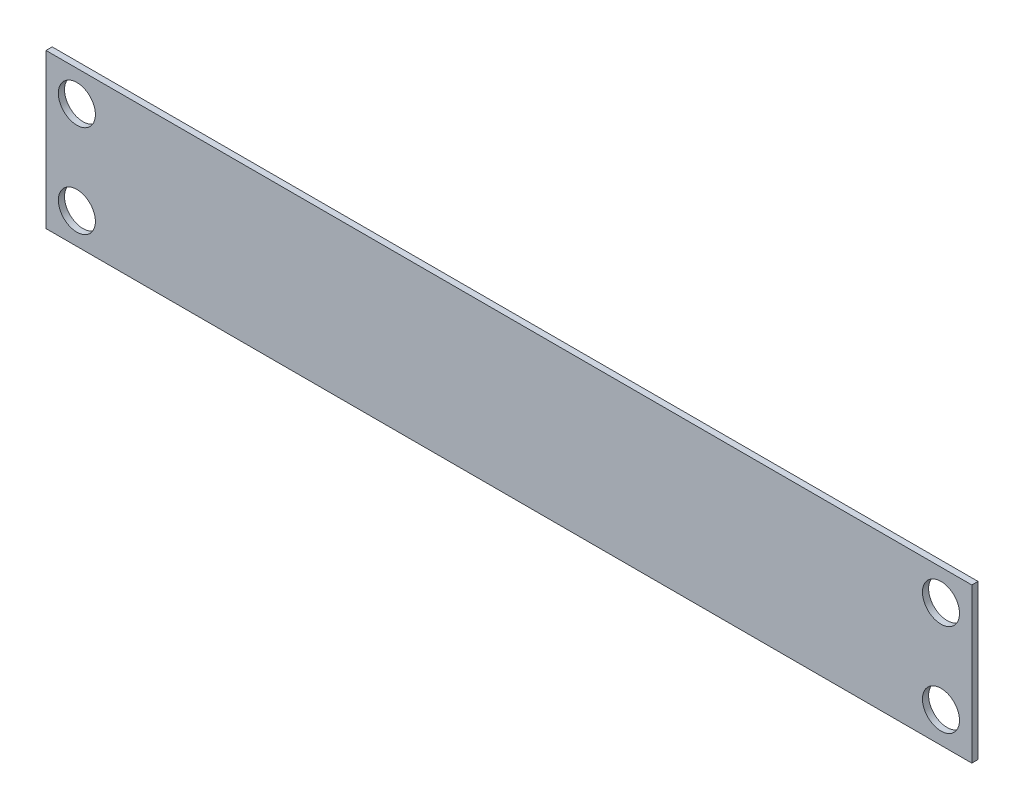
ISO-10303-21;
HEADER;
FILE_DESCRIPTION(('STEP AP214'),'2;1');
FILE_NAME('part.step','',(''),(''),'','','');
FILE_SCHEMA(('AUTOMOTIVE_DESIGN { 1 0 10303 214 1 1 1 1 }'));
ENDSEC;
DATA;
#1=APPLICATION_CONTEXT('core data for automotive mechanical design processes');
#2=APPLICATION_PROTOCOL_DEFINITION('international standard','automotive_design',2000,#1);
#3=PRODUCT_CONTEXT('',#1,'mechanical');
#4=PRODUCT('Part','Part','',(#3));
#5=PRODUCT_RELATED_PRODUCT_CATEGORY('part','',(#4));
#6=PRODUCT_DEFINITION_FORMATION('','',#4);
#7=PRODUCT_DEFINITION_CONTEXT('part definition',#1,'design');
#8=PRODUCT_DEFINITION('design','',#6,#7);
#9=PRODUCT_DEFINITION_SHAPE('','',#8);
#10=(LENGTH_UNIT() NAMED_UNIT(*) SI_UNIT(.MILLI.,.METRE.));
#11=(NAMED_UNIT(*) PLANE_ANGLE_UNIT() SI_UNIT($,.RADIAN.));
#12=(NAMED_UNIT(*) SI_UNIT($,.STERADIAN.) SOLID_ANGLE_UNIT());
#13=UNCERTAINTY_MEASURE_WITH_UNIT(LENGTH_MEASURE(1.E-05),#10,'distance_accuracy_value','');
#14=(GEOMETRIC_REPRESENTATION_CONTEXT(3) GLOBAL_UNCERTAINTY_ASSIGNED_CONTEXT((#13)) GLOBAL_UNIT_ASSIGNED_CONTEXT((#10,
#11,#12)) REPRESENTATION_CONTEXT('',''));
#15=CARTESIAN_POINT('',(0.,0.,0.));
#16=DIRECTION('',(0.,0.,1.));
#17=DIRECTION('',(1.,0.,0.));
#18=AXIS2_PLACEMENT_3D('',#15,#16,#17);
#19=CARTESIAN_POINT('',(150.,-25.,2.));
#20=DIRECTION('',(-1.,0.,0.));
#21=DIRECTION('',(0.,0.,1.));
#22=AXIS2_PLACEMENT_3D('',#19,#20,#21);
#23=PLANE('',#22);
#24=DIRECTION('',(0.,1.,0.));
#25=VECTOR('',#24,1.);
#26=CARTESIAN_POINT('',(150.,-25.,0.));
#27=LINE('',#26,#25);
#28=CARTESIAN_POINT('',(150.,-25.,0.));
#29=VERTEX_POINT('',#28);
#30=CARTESIAN_POINT('',(150.,25.,0.));
#31=VERTEX_POINT('',#30);
#32=EDGE_CURVE('E113',#29,#31,#27,.T.);
#33=ORIENTED_EDGE('',*,*,#32,.T.);
#34=DIRECTION('',(0.,0.,-1.));
#35=VECTOR('',#34,1.);
#36=CARTESIAN_POINT('',(150.,25.,2.));
#37=LINE('',#36,#35);
#38=CARTESIAN_POINT('',(150.,25.,2.));
#39=VERTEX_POINT('',#38);
#40=EDGE_CURVE('E11',#39,#31,#37,.T.);
#41=ORIENTED_EDGE('',*,*,#40,.F.);
#42=DIRECTION('',(0.,1.,0.));
#43=VECTOR('',#42,1.);
#44=CARTESIAN_POINT('',(150.,-25.,2.));
#45=LINE('',#44,#43);
#46=CARTESIAN_POINT('',(150.,-25.,2.));
#47=VERTEX_POINT('',#46);
#48=EDGE_CURVE('E97',#47,#39,#45,.T.);
#49=ORIENTED_EDGE('',*,*,#48,.F.);
#50=DIRECTION('',(0.,0.,-1.));
#51=VECTOR('',#50,1.);
#52=CARTESIAN_POINT('',(150.,-25.,2.));
#53=LINE('',#52,#51);
#54=EDGE_CURVE('E109',#47,#29,#53,.T.);
#55=ORIENTED_EDGE('',*,*,#54,.T.);
#56=EDGE_LOOP('',(#33,#41,#49,#55));
#57=FACE_BOUND('',#56,.T.);
#58=ADVANCED_FACE('F45',(#57),#23,.F.);
#59=CARTESIAN_POINT('',(-150.,25.,2.));
#60=DIRECTION('',(0.,-1.,0.));
#61=DIRECTION('',(0.,0.,-1.));
#62=AXIS2_PLACEMENT_3D('',#59,#60,#61);
#63=PLANE('',#62);
#64=DIRECTION('',(-1.,0.,0.));
#65=VECTOR('',#64,1.);
#66=CARTESIAN_POINT('',(-150.,25.,0.));
#67=LINE('',#66,#65);
#68=CARTESIAN_POINT('',(-150.,25.,0.));
#69=VERTEX_POINT('',#68);
#70=EDGE_CURVE('E102',#31,#69,#67,.T.);
#71=ORIENTED_EDGE('',*,*,#70,.T.);
#72=DIRECTION('',(0.,0.,-1.));
#73=VECTOR('',#72,1.);
#74=CARTESIAN_POINT('',(-150.,25.,2.));
#75=LINE('',#74,#73);
#76=CARTESIAN_POINT('',(-150.,25.,2.));
#77=VERTEX_POINT('',#76);
#78=EDGE_CURVE('E54',#77,#69,#75,.T.);
#79=ORIENTED_EDGE('',*,*,#78,.F.);
#80=DIRECTION('',(-1.,0.,0.));
#81=VECTOR('',#80,1.);
#82=CARTESIAN_POINT('',(-150.,25.,2.));
#83=LINE('',#82,#81);
#84=EDGE_CURVE('E92',#39,#77,#83,.T.);
#85=ORIENTED_EDGE('',*,*,#84,.F.);
#86=ORIENTED_EDGE('',*,*,#40,.T.);
#87=EDGE_LOOP('',(#71,#79,#85,#86));
#88=FACE_BOUND('',#87,.T.);
#89=ADVANCED_FACE('F101',(#88),#63,.F.);
#90=CARTESIAN_POINT('',(-150.,-25.,2.));
#91=DIRECTION('',(1.,0.,0.));
#92=DIRECTION('',(0.,0.,-1.));
#93=AXIS2_PLACEMENT_3D('',#90,#91,#92);
#94=PLANE('',#93);
#95=DIRECTION('',(0.,-1.,0.));
#96=VECTOR('',#95,1.);
#97=CARTESIAN_POINT('',(-150.,-25.,0.));
#98=LINE('',#97,#96);
#99=CARTESIAN_POINT('',(-150.,-25.,0.));
#100=VERTEX_POINT('',#99);
#101=EDGE_CURVE('E79',#69,#100,#98,.T.);
#102=ORIENTED_EDGE('',*,*,#101,.T.);
#103=DIRECTION('',(0.,0.,-1.));
#104=VECTOR('',#103,1.);
#105=CARTESIAN_POINT('',(-150.,-25.,2.));
#106=LINE('',#105,#104);
#107=CARTESIAN_POINT('',(-150.,-25.,2.));
#108=VERTEX_POINT('',#107);
#109=EDGE_CURVE('E104',#108,#100,#106,.T.);
#110=ORIENTED_EDGE('',*,*,#109,.F.);
#111=DIRECTION('',(0.,-1.,0.));
#112=VECTOR('',#111,1.);
#113=CARTESIAN_POINT('',(-150.,-25.,2.));
#114=LINE('',#113,#112);
#115=EDGE_CURVE('E95',#77,#108,#114,.T.);
#116=ORIENTED_EDGE('',*,*,#115,.F.);
#117=ORIENTED_EDGE('',*,*,#78,.T.);
#118=EDGE_LOOP('',(#102,#110,#116,#117));
#119=FACE_BOUND('',#118,.T.);
#120=ADVANCED_FACE('F105',(#119),#94,.F.);
#121=CARTESIAN_POINT('',(-150.,-25.,2.));
#122=DIRECTION('',(0.,1.,0.));
#123=DIRECTION('',(0.,0.,1.));
#124=AXIS2_PLACEMENT_3D('',#121,#122,#123);
#125=PLANE('',#124);
#126=DIRECTION('',(1.,0.,0.));
#127=VECTOR('',#126,1.);
#128=CARTESIAN_POINT('',(-150.,-25.,0.));
#129=LINE('',#128,#127);
#130=EDGE_CURVE('E85',#100,#29,#129,.T.);
#131=ORIENTED_EDGE('',*,*,#130,.T.);
#132=ORIENTED_EDGE('',*,*,#54,.F.);
#133=DIRECTION('',(1.,0.,0.));
#134=VECTOR('',#133,1.);
#135=CARTESIAN_POINT('',(-150.,-25.,2.));
#136=LINE('',#135,#134);
#137=EDGE_CURVE('E62',#108,#47,#136,.T.);
#138=ORIENTED_EDGE('',*,*,#137,.F.);
#139=ORIENTED_EDGE('',*,*,#109,.T.);
#140=EDGE_LOOP('',(#131,#132,#138,#139));
#141=FACE_BOUND('',#140,.T.);
#142=ADVANCED_FACE('F127',(#141),#125,.F.);
#143=CARTESIAN_POINT('',(0.,0.,2.));
#144=DIRECTION('',(0.,0.,-1.));
#145=DIRECTION('',(-1.,0.,0.));
#146=AXIS2_PLACEMENT_3D('',#143,#144,#145);
#147=PLANE('',#146);
#148=CARTESIAN_POINT('',(140.,15.,2.));
#149=DIRECTION('',(0.,0.,1.));
#150=DIRECTION('',(-1.,0.,0.));
#151=AXIS2_PLACEMENT_3D('',#148,#149,#150);
#152=CIRCLE('',#151,6.00000000000002);
#153=CARTESIAN_POINT('',(134.,15.,2.));
#154=VERTEX_POINT('',#153);
#155=EDGE_CURVE('E158',#154,#154,#152,.T.);
#156=ORIENTED_EDGE('',*,*,#155,.F.);
#157=EDGE_LOOP('',(#156));
#158=FACE_BOUND('',#157,.T.);
#159=CARTESIAN_POINT('',(140.,-15.,2.));
#160=DIRECTION('',(0.,0.,-1.));
#161=DIRECTION('',(-1.,0.,0.));
#162=AXIS2_PLACEMENT_3D('',#159,#160,#161);
#163=CIRCLE('',#162,6.00000000000002);
#164=CARTESIAN_POINT('',(134.,-15.,2.));
#165=VERTEX_POINT('',#164);
#166=EDGE_CURVE('E150',#165,#165,#163,.T.);
#167=ORIENTED_EDGE('',*,*,#166,.T.);
#168=EDGE_LOOP('',(#167));
#169=FACE_BOUND('',#168,.T.);
#170=CARTESIAN_POINT('',(-140.,15.,2.));
#171=DIRECTION('',(0.,0.,-1.));
#172=DIRECTION('',(1.,0.,0.));
#173=AXIS2_PLACEMENT_3D('',#170,#171,#172);
#174=CIRCLE('',#173,6.00000000000002);
#175=CARTESIAN_POINT('',(-134.,15.,2.));
#176=VERTEX_POINT('',#175);
#177=EDGE_CURVE('E142',#176,#176,#174,.T.);
#178=ORIENTED_EDGE('',*,*,#177,.T.);
#179=EDGE_LOOP('',(#178));
#180=FACE_BOUND('',#179,.T.);
#181=CARTESIAN_POINT('',(-140.,-15.,2.));
#182=DIRECTION('',(0.,0.,1.));
#183=DIRECTION('',(1.,0.,0.));
#184=AXIS2_PLACEMENT_3D('',#181,#182,#183);
#185=CIRCLE('',#184,6.00000000000002);
#186=CARTESIAN_POINT('',(-134.,-15.,2.));
#187=VERTEX_POINT('',#186);
#188=EDGE_CURVE('E134',#187,#187,#185,.T.);
#189=ORIENTED_EDGE('',*,*,#188,.F.);
#190=EDGE_LOOP('',(#189));
#191=FACE_BOUND('',#190,.T.);
#192=ORIENTED_EDGE('',*,*,#48,.T.);
#193=ORIENTED_EDGE('',*,*,#84,.T.);
#194=ORIENTED_EDGE('',*,*,#115,.T.);
#195=ORIENTED_EDGE('',*,*,#137,.T.);
#196=EDGE_LOOP('',(#192,#193,#194,#195));
#197=FACE_BOUND('',#196,.T.);
#198=ADVANCED_FACE('F93',(#158,#169,#180,#191,#197),#147,.F.);
#199=CARTESIAN_POINT('',(0.,0.,0.));
#200=DIRECTION('',(0.,0.,-1.));
#201=DIRECTION('',(-1.,0.,0.));
#202=AXIS2_PLACEMENT_3D('',#199,#200,#201);
#203=PLANE('',#202);
#204=CARTESIAN_POINT('',(140.,15.,0.));
#205=DIRECTION('',(0.,0.,1.));
#206=DIRECTION('',(-1.,0.,0.));
#207=AXIS2_PLACEMENT_3D('',#204,#205,#206);
#208=CIRCLE('',#207,6.00000000000002);
#209=CARTESIAN_POINT('',(134.,15.,0.));
#210=VERTEX_POINT('',#209);
#211=EDGE_CURVE('E154',#210,#210,#208,.T.);
#212=ORIENTED_EDGE('',*,*,#211,.T.);
#213=EDGE_LOOP('',(#212));
#214=FACE_BOUND('',#213,.T.);
#215=CARTESIAN_POINT('',(140.,-15.,0.));
#216=DIRECTION('',(0.,0.,-1.));
#217=DIRECTION('',(-1.,0.,0.));
#218=AXIS2_PLACEMENT_3D('',#215,#216,#217);
#219=CIRCLE('',#218,6.00000000000002);
#220=CARTESIAN_POINT('',(134.,-15.,0.));
#221=VERTEX_POINT('',#220);
#222=EDGE_CURVE('E146',#221,#221,#219,.T.);
#223=ORIENTED_EDGE('',*,*,#222,.F.);
#224=EDGE_LOOP('',(#223));
#225=FACE_BOUND('',#224,.T.);
#226=CARTESIAN_POINT('',(-140.,15.,0.));
#227=DIRECTION('',(0.,0.,-1.));
#228=DIRECTION('',(1.,0.,0.));
#229=AXIS2_PLACEMENT_3D('',#226,#227,#228);
#230=CIRCLE('',#229,6.00000000000002);
#231=CARTESIAN_POINT('',(-134.,15.,0.));
#232=VERTEX_POINT('',#231);
#233=EDGE_CURVE('E138',#232,#232,#230,.T.);
#234=ORIENTED_EDGE('',*,*,#233,.F.);
#235=EDGE_LOOP('',(#234));
#236=FACE_BOUND('',#235,.T.);
#237=CARTESIAN_POINT('',(-140.,-15.,0.));
#238=DIRECTION('',(0.,0.,1.));
#239=DIRECTION('',(1.,0.,0.));
#240=AXIS2_PLACEMENT_3D('',#237,#238,#239);
#241=CIRCLE('',#240,6.00000000000002);
#242=CARTESIAN_POINT('',(-134.,-15.,0.));
#243=VERTEX_POINT('',#242);
#244=EDGE_CURVE('E117',#243,#243,#241,.T.);
#245=ORIENTED_EDGE('',*,*,#244,.T.);
#246=EDGE_LOOP('',(#245));
#247=FACE_BOUND('',#246,.T.);
#248=ORIENTED_EDGE('',*,*,#32,.F.);
#249=ORIENTED_EDGE('',*,*,#130,.F.);
#250=ORIENTED_EDGE('',*,*,#101,.F.);
#251=ORIENTED_EDGE('',*,*,#70,.F.);
#252=EDGE_LOOP('',(#248,#249,#250,#251));
#253=FACE_BOUND('',#252,.T.);
#254=ADVANCED_FACE('F130',(#214,#225,#236,#247,#253),#203,.T.);
#255=CARTESIAN_POINT('',(-140.,-15.,0.));
#256=DIRECTION('',(0.,0.,1.));
#257=DIRECTION('',(1.,0.,0.));
#258=AXIS2_PLACEMENT_3D('',#255,#256,#257);
#259=CYLINDRICAL_SURFACE('',#258,6.00000000000002);
#260=ORIENTED_EDGE('',*,*,#244,.F.);
#261=EDGE_LOOP('',(#260));
#262=FACE_BOUND('',#261,.T.);
#263=ORIENTED_EDGE('',*,*,#188,.T.);
#264=EDGE_LOOP('',(#263));
#265=FACE_BOUND('',#264,.T.);
#266=ADVANCED_FACE('F184',(#262,#265),#259,.F.);
#267=CARTESIAN_POINT('',(-140.,15.,0.));
#268=DIRECTION('',(0.,0.,1.));
#269=DIRECTION('',(1.,0.,0.));
#270=AXIS2_PLACEMENT_3D('',#267,#268,#269);
#271=CYLINDRICAL_SURFACE('',#270,6.00000000000002);
#272=ORIENTED_EDGE('',*,*,#233,.T.);
#273=EDGE_LOOP('',(#272));
#274=FACE_BOUND('',#273,.T.);
#275=ORIENTED_EDGE('',*,*,#177,.F.);
#276=EDGE_LOOP('',(#275));
#277=FACE_BOUND('',#276,.T.);
#278=ADVANCED_FACE('F186',(#274,#277),#271,.F.);
#279=CARTESIAN_POINT('',(140.,-15.,0.));
#280=DIRECTION('',(0.,0.,1.));
#281=DIRECTION('',(1.,0.,0.));
#282=AXIS2_PLACEMENT_3D('',#279,#280,#281);
#283=CYLINDRICAL_SURFACE('',#282,6.00000000000002);
#284=ORIENTED_EDGE('',*,*,#222,.T.);
#285=EDGE_LOOP('',(#284));
#286=FACE_BOUND('',#285,.T.);
#287=ORIENTED_EDGE('',*,*,#166,.F.);
#288=EDGE_LOOP('',(#287));
#289=FACE_BOUND('',#288,.T.);
#290=ADVANCED_FACE('F171',(#286,#289),#283,.F.);
#291=CARTESIAN_POINT('',(140.,15.,0.));
#292=DIRECTION('',(0.,0.,1.));
#293=DIRECTION('',(1.,0.,0.));
#294=AXIS2_PLACEMENT_3D('',#291,#292,#293);
#295=CYLINDRICAL_SURFACE('',#294,6.00000000000002);
#296=ORIENTED_EDGE('',*,*,#211,.F.);
#297=EDGE_LOOP('',(#296));
#298=FACE_BOUND('',#297,.T.);
#299=ORIENTED_EDGE('',*,*,#155,.T.);
#300=EDGE_LOOP('',(#299));
#301=FACE_BOUND('',#300,.T.);
#302=ADVANCED_FACE('F168',(#298,#301),#295,.F.);
#303=CLOSED_SHELL('',(#58,#89,#120,#142,#198,#254,#266,#278,#290,#302));
#304=MANIFOLD_SOLID_BREP('B2',#303);
#305=ADVANCED_BREP_SHAPE_REPRESENTATION('',(#18,#304),#14);
#306=SHAPE_DEFINITION_REPRESENTATION(#9,#305);
ENDSEC;
END-ISO-10303-21;
